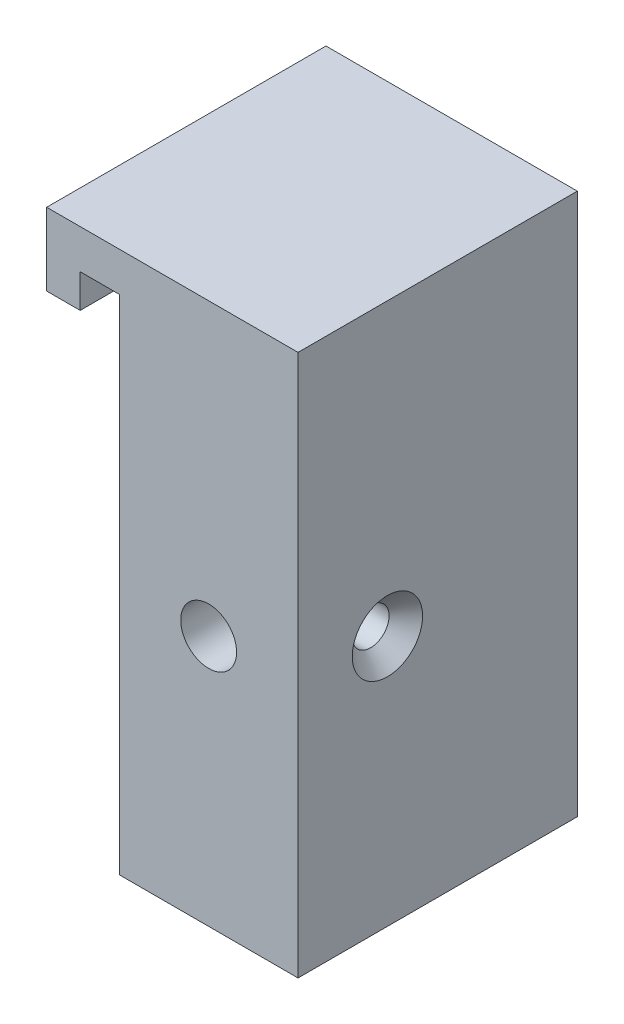
ISO-10303-21;
HEADER;
FILE_DESCRIPTION(('STEP AP214'),'2;1');
FILE_NAME('part.step','',(''),(''),'','','');
FILE_SCHEMA(('AUTOMOTIVE_DESIGN { 1 0 10303 214 1 1 1 1 }'));
ENDSEC;
DATA;
#1=APPLICATION_CONTEXT('core data for automotive mechanical design processes');
#2=APPLICATION_PROTOCOL_DEFINITION('international standard','automotive_design',2000,#1);
#3=PRODUCT_CONTEXT('',#1,'mechanical');
#4=PRODUCT('Part','Part','',(#3));
#5=PRODUCT_RELATED_PRODUCT_CATEGORY('part','',(#4));
#6=PRODUCT_DEFINITION_FORMATION('','',#4);
#7=PRODUCT_DEFINITION_CONTEXT('part definition',#1,'design');
#8=PRODUCT_DEFINITION('design','',#6,#7);
#9=PRODUCT_DEFINITION_SHAPE('','',#8);
#10=(LENGTH_UNIT() NAMED_UNIT(*) SI_UNIT(.MILLI.,.METRE.));
#11=(NAMED_UNIT(*) PLANE_ANGLE_UNIT() SI_UNIT($,.RADIAN.));
#12=(NAMED_UNIT(*) SI_UNIT($,.STERADIAN.) SOLID_ANGLE_UNIT());
#13=UNCERTAINTY_MEASURE_WITH_UNIT(LENGTH_MEASURE(1.E-05),#10,'distance_accuracy_value','');
#14=(GEOMETRIC_REPRESENTATION_CONTEXT(3) GLOBAL_UNCERTAINTY_ASSIGNED_CONTEXT((#13)) GLOBAL_UNIT_ASSIGNED_CONTEXT((#10,
#11,#12)) REPRESENTATION_CONTEXT('',''));
#15=CARTESIAN_POINT('',(0.,0.,0.));
#16=DIRECTION('',(0.,0.,1.));
#17=DIRECTION('',(1.,0.,0.));
#18=AXIS2_PLACEMENT_3D('',#15,#16,#17);
#19=CARTESIAN_POINT('',(-32.,0.,25.));
#20=DIRECTION('',(0.,1.,0.));
#21=DIRECTION('',(0.,0.,1.));
#22=AXIS2_PLACEMENT_3D('',#19,#20,#21);
#23=PLANE('',#22);
#24=CARTESIAN_POINT('',(-7.,0.,0.));
#25=DIRECTION('',(0.,-1.,0.));
#26=DIRECTION('',(0.,0.,-1.));
#27=AXIS2_PLACEMENT_3D('',#24,#25,#26);
#28=CIRCLE('',#27,3.5);
#29=CARTESIAN_POINT('',(-7.,0.,-3.5));
#30=VERTEX_POINT('',#29);
#31=EDGE_CURVE('E231',#30,#30,#28,.T.);
#32=ORIENTED_EDGE('',*,*,#31,.F.);
#33=EDGE_LOOP('',(#32));
#34=FACE_BOUND('',#33,.T.);
#35=CARTESIAN_POINT('',(-25.,0.,0.));
#36=DIRECTION('',(0.,-1.,0.));
#37=DIRECTION('',(0.,0.,-1.));
#38=AXIS2_PLACEMENT_3D('',#35,#36,#37);
#39=CIRCLE('',#38,3.5);
#40=CARTESIAN_POINT('',(-25.,0.,-3.5));
#41=VERTEX_POINT('',#40);
#42=EDGE_CURVE('E223',#41,#41,#39,.T.);
#43=ORIENTED_EDGE('',*,*,#42,.F.);
#44=EDGE_LOOP('',(#43));
#45=FACE_BOUND('',#44,.T.);
#46=DIRECTION('',(1.,0.,0.));
#47=VECTOR('',#46,1.);
#48=CARTESIAN_POINT('',(-32.,0.,-25.));
#49=LINE('',#48,#47);
#50=CARTESIAN_POINT('',(-32.,0.,-25.));
#51=VERTEX_POINT('',#50);
#52=CARTESIAN_POINT('',(0.,0.,-25.));
#53=VERTEX_POINT('',#52);
#54=EDGE_CURVE('E145',#51,#53,#49,.T.);
#55=ORIENTED_EDGE('',*,*,#54,.T.);
#56=DIRECTION('',(0.,0.,-1.));
#57=VECTOR('',#56,1.);
#58=CARTESIAN_POINT('',(0.,0.,25.));
#59=LINE('',#58,#57);
#60=CARTESIAN_POINT('',(0.,0.,25.));
#61=VERTEX_POINT('',#60);
#62=EDGE_CURVE('E11',#61,#53,#59,.T.);
#63=ORIENTED_EDGE('',*,*,#62,.F.);
#64=DIRECTION('',(1.,0.,0.));
#65=VECTOR('',#64,1.);
#66=CARTESIAN_POINT('',(-32.,0.,25.));
#67=LINE('',#66,#65);
#68=CARTESIAN_POINT('',(-32.,0.,25.));
#69=VERTEX_POINT('',#68);
#70=EDGE_CURVE('E168',#69,#61,#67,.T.);
#71=ORIENTED_EDGE('',*,*,#70,.F.);
#72=DIRECTION('',(0.,0.,-1.));
#73=VECTOR('',#72,1.);
#74=CARTESIAN_POINT('',(-32.,0.,25.));
#75=LINE('',#74,#73);
#76=EDGE_CURVE('E141',#69,#51,#75,.T.);
#77=ORIENTED_EDGE('',*,*,#76,.T.);
#78=EDGE_LOOP('',(#55,#63,#71,#77));
#79=FACE_BOUND('',#78,.T.);
#80=ADVANCED_FACE('F44',(#34,#45,#79),#23,.F.);
#81=CARTESIAN_POINT('',(0.,0.,25.));
#82=DIRECTION('',(-1.,0.,0.));
#83=DIRECTION('',(0.,0.,1.));
#84=AXIS2_PLACEMENT_3D('',#81,#82,#83);
#85=PLANE('',#84);
#86=CARTESIAN_POINT('',(0.,45.,9.));
#87=DIRECTION('',(1.,0.,0.));
#88=DIRECTION('',(0.,0.,-1.));
#89=AXIS2_PLACEMENT_3D('',#86,#87,#88);
#90=CIRCLE('',#89,6.3);
#91=CARTESIAN_POINT('',(0.,45.,2.7));
#92=VERTEX_POINT('',#91);
#93=EDGE_CURVE('E438',#92,#92,#90,.T.);
#94=ORIENTED_EDGE('',*,*,#93,.F.);
#95=EDGE_LOOP('',(#94));
#96=FACE_BOUND('',#95,.T.);
#97=DIRECTION('',(0.,1.,0.));
#98=VECTOR('',#97,1.);
#99=CARTESIAN_POINT('',(0.,0.,-25.));
#100=LINE('',#99,#98);
#101=CARTESIAN_POINT('',(0.,97.,-25.));
#102=VERTEX_POINT('',#101);
#103=EDGE_CURVE('E149',#53,#102,#100,.T.);
#104=ORIENTED_EDGE('',*,*,#103,.T.);
#105=DIRECTION('',(0.,0.,-1.));
#106=VECTOR('',#105,1.);
#107=CARTESIAN_POINT('',(0.,97.,25.));
#108=LINE('',#107,#106);
#109=CARTESIAN_POINT('',(0.,97.,25.));
#110=VERTEX_POINT('',#109);
#111=EDGE_CURVE('E53',#110,#102,#108,.T.);
#112=ORIENTED_EDGE('',*,*,#111,.F.);
#113=DIRECTION('',(0.,1.,0.));
#114=VECTOR('',#113,1.);
#115=CARTESIAN_POINT('',(0.,0.,25.));
#116=LINE('',#115,#114);
#117=EDGE_CURVE('E104',#61,#110,#116,.T.);
#118=ORIENTED_EDGE('',*,*,#117,.F.);
#119=ORIENTED_EDGE('',*,*,#62,.T.);
#120=EDGE_LOOP('',(#104,#112,#118,#119));
#121=FACE_BOUND('',#120,.T.);
#122=ADVANCED_FACE('F262',(#96,#121),#85,.F.);
#123=CARTESIAN_POINT('',(0.,97.,25.));
#124=DIRECTION('',(0.,-1.,0.));
#125=DIRECTION('',(0.,0.,-1.));
#126=AXIS2_PLACEMENT_3D('',#123,#124,#125);
#127=PLANE('',#126);
#128=DIRECTION('',(-1.,0.,0.));
#129=VECTOR('',#128,1.);
#130=CARTESIAN_POINT('',(0.,97.,-25.));
#131=LINE('',#130,#129);
#132=CARTESIAN_POINT('',(-45.,97.,-25.));
#133=VERTEX_POINT('',#132);
#134=EDGE_CURVE('E153',#102,#133,#131,.T.);
#135=ORIENTED_EDGE('',*,*,#134,.T.);
#136=DIRECTION('',(0.,0.,-1.));
#137=VECTOR('',#136,1.);
#138=CARTESIAN_POINT('',(-45.,97.,25.));
#139=LINE('',#138,#137);
#140=CARTESIAN_POINT('',(-45.,97.,25.));
#141=VERTEX_POINT('',#140);
#142=EDGE_CURVE('E179',#141,#133,#139,.T.);
#143=ORIENTED_EDGE('',*,*,#142,.F.);
#144=DIRECTION('',(-1.,0.,0.));
#145=VECTOR('',#144,1.);
#146=CARTESIAN_POINT('',(0.,97.,25.));
#147=LINE('',#146,#145);
#148=EDGE_CURVE('E189',#110,#141,#147,.T.);
#149=ORIENTED_EDGE('',*,*,#148,.F.);
#150=ORIENTED_EDGE('',*,*,#111,.T.);
#151=EDGE_LOOP('',(#135,#143,#149,#150));
#152=FACE_BOUND('',#151,.T.);
#153=ADVANCED_FACE('F187',(#152),#127,.F.);
#154=CARTESIAN_POINT('',(-45.,97.,25.));
#155=DIRECTION('',(1.,0.,0.));
#156=DIRECTION('',(0.,0.,-1.));
#157=AXIS2_PLACEMENT_3D('',#154,#155,#156);
#158=PLANE('',#157);
#159=DIRECTION('',(0.,-1.,0.));
#160=VECTOR('',#159,1.);
#161=CARTESIAN_POINT('',(-45.,97.,-25.));
#162=LINE('',#161,#160);
#163=CARTESIAN_POINT('',(-45.,84.,-25.));
#164=VERTEX_POINT('',#163);
#165=EDGE_CURVE('E156',#133,#164,#162,.T.);
#166=ORIENTED_EDGE('',*,*,#165,.T.);
#167=DIRECTION('',(0.,0.,-1.));
#168=VECTOR('',#167,1.);
#169=CARTESIAN_POINT('',(-45.,84.,25.));
#170=LINE('',#169,#168);
#171=CARTESIAN_POINT('',(-45.,84.,25.));
#172=VERTEX_POINT('',#171);
#173=EDGE_CURVE('E175',#172,#164,#170,.T.);
#174=ORIENTED_EDGE('',*,*,#173,.F.);
#175=DIRECTION('',(0.,-1.,0.));
#176=VECTOR('',#175,1.);
#177=CARTESIAN_POINT('',(-45.,97.,25.));
#178=LINE('',#177,#176);
#179=EDGE_CURVE('E202',#141,#172,#178,.T.);
#180=ORIENTED_EDGE('',*,*,#179,.F.);
#181=ORIENTED_EDGE('',*,*,#142,.T.);
#182=EDGE_LOOP('',(#166,#174,#180,#181));
#183=FACE_BOUND('',#182,.T.);
#184=ADVANCED_FACE('F197',(#183),#158,.F.);
#185=CARTESIAN_POINT('',(-45.,84.,25.));
#186=DIRECTION('',(0.,1.,0.));
#187=DIRECTION('',(0.,0.,1.));
#188=AXIS2_PLACEMENT_3D('',#185,#186,#187);
#189=PLANE('',#188);
#190=DIRECTION('',(1.,0.,0.));
#191=VECTOR('',#190,1.);
#192=CARTESIAN_POINT('',(-45.,84.,-25.));
#193=LINE('',#192,#191);
#194=CARTESIAN_POINT('',(-39.,84.,-25.));
#195=VERTEX_POINT('',#194);
#196=EDGE_CURVE('E159',#164,#195,#193,.T.);
#197=ORIENTED_EDGE('',*,*,#196,.T.);
#198=DIRECTION('',(0.,0.,-1.));
#199=VECTOR('',#198,1.);
#200=CARTESIAN_POINT('',(-39.,84.,25.));
#201=LINE('',#200,#199);
#202=CARTESIAN_POINT('',(-39.,84.,25.));
#203=VERTEX_POINT('',#202);
#204=EDGE_CURVE('E134',#203,#195,#201,.T.);
#205=ORIENTED_EDGE('',*,*,#204,.F.);
#206=DIRECTION('',(1.,0.,0.));
#207=VECTOR('',#206,1.);
#208=CARTESIAN_POINT('',(-45.,84.,25.));
#209=LINE('',#208,#207);
#210=EDGE_CURVE('E123',#172,#203,#209,.T.);
#211=ORIENTED_EDGE('',*,*,#210,.F.);
#212=ORIENTED_EDGE('',*,*,#173,.T.);
#213=EDGE_LOOP('',(#197,#205,#211,#212));
#214=FACE_BOUND('',#213,.T.);
#215=ADVANCED_FACE('F200',(#214),#189,.F.);
#216=CARTESIAN_POINT('',(-39.,84.,25.));
#217=DIRECTION('',(-1.,0.,0.));
#218=DIRECTION('',(0.,0.,1.));
#219=AXIS2_PLACEMENT_3D('',#216,#217,#218);
#220=PLANE('',#219);
#221=DIRECTION('',(0.,1.,0.));
#222=VECTOR('',#221,1.);
#223=CARTESIAN_POINT('',(-39.,84.,-25.));
#224=LINE('',#223,#222);
#225=CARTESIAN_POINT('',(-39.,90.,-25.));
#226=VERTEX_POINT('',#225);
#227=EDGE_CURVE('E132',#195,#226,#224,.T.);
#228=ORIENTED_EDGE('',*,*,#227,.T.);
#229=DIRECTION('',(0.,0.,-1.));
#230=VECTOR('',#229,1.);
#231=CARTESIAN_POINT('',(-39.,90.,25.));
#232=LINE('',#231,#230);
#233=CARTESIAN_POINT('',(-39.,90.,25.));
#234=VERTEX_POINT('',#233);
#235=EDGE_CURVE('E129',#234,#226,#232,.T.);
#236=ORIENTED_EDGE('',*,*,#235,.F.);
#237=DIRECTION('',(0.,1.,0.));
#238=VECTOR('',#237,1.);
#239=CARTESIAN_POINT('',(-39.,84.,25.));
#240=LINE('',#239,#238);
#241=EDGE_CURVE('E117',#203,#234,#240,.T.);
#242=ORIENTED_EDGE('',*,*,#241,.F.);
#243=ORIENTED_EDGE('',*,*,#204,.T.);
#244=EDGE_LOOP('',(#228,#236,#242,#243));
#245=FACE_BOUND('',#244,.T.);
#246=ADVANCED_FACE('F130',(#245),#220,.F.);
#247=CARTESIAN_POINT('',(-39.,90.,25.));
#248=DIRECTION('',(0.,1.,0.));
#249=DIRECTION('',(0.,0.,1.));
#250=AXIS2_PLACEMENT_3D('',#247,#248,#249);
#251=PLANE('',#250);
#252=DIRECTION('',(1.,0.,0.));
#253=VECTOR('',#252,1.);
#254=CARTESIAN_POINT('',(-39.,90.,-25.));
#255=LINE('',#254,#253);
#256=CARTESIAN_POINT('',(-32.,90.,-25.));
#257=VERTEX_POINT('',#256);
#258=EDGE_CURVE('E90',#226,#257,#255,.T.);
#259=ORIENTED_EDGE('',*,*,#258,.T.);
#260=DIRECTION('',(0.,0.,-1.));
#261=VECTOR('',#260,1.);
#262=CARTESIAN_POINT('',(-32.,90.,25.));
#263=LINE('',#262,#261);
#264=CARTESIAN_POINT('',(-32.,90.,25.));
#265=VERTEX_POINT('',#264);
#266=EDGE_CURVE('E135',#265,#257,#263,.T.);
#267=ORIENTED_EDGE('',*,*,#266,.F.);
#268=DIRECTION('',(1.,0.,0.));
#269=VECTOR('',#268,1.);
#270=CARTESIAN_POINT('',(-39.,90.,25.));
#271=LINE('',#270,#269);
#272=EDGE_CURVE('E121',#234,#265,#271,.T.);
#273=ORIENTED_EDGE('',*,*,#272,.F.);
#274=ORIENTED_EDGE('',*,*,#235,.T.);
#275=EDGE_LOOP('',(#259,#267,#273,#274));
#276=FACE_BOUND('',#275,.T.);
#277=ADVANCED_FACE('F137',(#276),#251,.F.);
#278=CARTESIAN_POINT('',(-32.,90.,25.));
#279=DIRECTION('',(1.,0.,0.));
#280=DIRECTION('',(0.,1.,0.));
#281=AXIS2_PLACEMENT_3D('',#278,#279,#280);
#282=PLANE('',#281);
#283=DIRECTION('',(0.,-1.,0.));
#284=VECTOR('',#283,1.);
#285=CARTESIAN_POINT('',(-32.,90.,-25.));
#286=LINE('',#285,#284);
#287=EDGE_CURVE('E96',#257,#51,#286,.T.);
#288=ORIENTED_EDGE('',*,*,#287,.T.);
#289=ORIENTED_EDGE('',*,*,#76,.F.);
#290=DIRECTION('',(0.,-1.,0.));
#291=VECTOR('',#290,1.);
#292=CARTESIAN_POINT('',(-32.,90.,25.));
#293=LINE('',#292,#291);
#294=EDGE_CURVE('E61',#265,#69,#293,.T.);
#295=ORIENTED_EDGE('',*,*,#294,.F.);
#296=ORIENTED_EDGE('',*,*,#266,.T.);
#297=EDGE_LOOP('',(#288,#289,#295,#296));
#298=FACE_BOUND('',#297,.T.);
#299=ADVANCED_FACE('F274',(#298),#282,.F.);
#300=CARTESIAN_POINT('',(0.,0.,25.));
#301=DIRECTION('',(0.,0.,1.));
#302=DIRECTION('',(1.,0.,0.));
#303=AXIS2_PLACEMENT_3D('',#300,#301,#302);
#304=PLANE('',#303);
#305=CARTESIAN_POINT('',(-16.,45.,25.));
#306=DIRECTION('',(0.,0.,1.));
#307=DIRECTION('',(1.,0.,0.));
#308=AXIS2_PLACEMENT_3D('',#305,#306,#307);
#309=CIRCLE('',#308,4.99999999999999);
#310=CARTESIAN_POINT('',(-11.,45.,25.));
#311=VERTEX_POINT('',#310);
#312=EDGE_CURVE('E215',#311,#311,#309,.T.);
#313=ORIENTED_EDGE('',*,*,#312,.F.);
#314=EDGE_LOOP('',(#313));
#315=FACE_BOUND('',#314,.T.);
#316=ORIENTED_EDGE('',*,*,#70,.T.);
#317=ORIENTED_EDGE('',*,*,#117,.T.);
#318=ORIENTED_EDGE('',*,*,#148,.T.);
#319=ORIENTED_EDGE('',*,*,#179,.T.);
#320=ORIENTED_EDGE('',*,*,#210,.T.);
#321=ORIENTED_EDGE('',*,*,#241,.T.);
#322=ORIENTED_EDGE('',*,*,#272,.T.);
#323=ORIENTED_EDGE('',*,*,#294,.T.);
#324=EDGE_LOOP('',(#316,#317,#318,#319,#320,#321,#322,#323));
#325=FACE_BOUND('',#324,.T.);
#326=ADVANCED_FACE('F119',(#315,#325),#304,.T.);
#327=CARTESIAN_POINT('',(0.,0.,-25.));
#328=DIRECTION('',(0.,0.,1.));
#329=DIRECTION('',(1.,0.,0.));
#330=AXIS2_PLACEMENT_3D('',#327,#328,#329);
#331=PLANE('',#330);
#332=ORIENTED_EDGE('',*,*,#54,.F.);
#333=ORIENTED_EDGE('',*,*,#287,.F.);
#334=ORIENTED_EDGE('',*,*,#258,.F.);
#335=ORIENTED_EDGE('',*,*,#227,.F.);
#336=ORIENTED_EDGE('',*,*,#196,.F.);
#337=ORIENTED_EDGE('',*,*,#165,.F.);
#338=ORIENTED_EDGE('',*,*,#134,.F.);
#339=ORIENTED_EDGE('',*,*,#103,.F.);
#340=EDGE_LOOP('',(#332,#333,#334,#335,#336,#337,#338,#339));
#341=FACE_BOUND('',#340,.T.);
#342=ADVANCED_FACE('F193',(#341),#331,.F.);
#343=CARTESIAN_POINT('',(-16.,45.,0.));
#344=DIRECTION('',(0.,0.,-1.));
#345=DIRECTION('',(-1.,0.,0.));
#346=AXIS2_PLACEMENT_3D('',#343,#344,#345);
#347=PLANE('',#346);
#348=CARTESIAN_POINT('',(-16.,45.,0.));
#349=DIRECTION('',(0.,0.,1.));
#350=DIRECTION('',(1.,0.,0.));
#351=AXIS2_PLACEMENT_3D('',#348,#349,#350);
#352=CIRCLE('',#351,5.);
#353=CARTESIAN_POINT('',(-11.,45.,0.));
#354=VERTEX_POINT('',#353);
#355=EDGE_CURVE('E150',#354,#354,#352,.T.);
#356=ORIENTED_EDGE('',*,*,#355,.T.);
#357=EDGE_LOOP('',(#356));
#358=FACE_BOUND('',#357,.T.);
#359=ADVANCED_FACE('F327',(#358),#347,.F.);
#360=CARTESIAN_POINT('',(-16.,45.,25.));
#361=DIRECTION('',(0.,0.,1.));
#362=DIRECTION('',(1.,0.,0.));
#363=AXIS2_PLACEMENT_3D('',#360,#361,#362);
#364=CYLINDRICAL_SURFACE('',#363,4.99999999999999);
#365=CARTESIAN_POINT('',(-11.,45.,5.7));
#366=CARTESIAN_POINT('',(-11.0000049797154,45.1661087100987,5.70000563881154));
#367=CARTESIAN_POINT('',(-11.0083524634531,45.3322524989141,5.7126141749076));
#368=CARTESIAN_POINT('',(-11.0409234694194,45.6592567617237,5.76228740100713));
#369=CARTESIAN_POINT('',(-11.0651567672503,45.8201139184527,5.79936714987673));
#370=CARTESIAN_POINT('',(-11.1270986084443,46.1313331561117,5.89572565911595));
#371=CARTESIAN_POINT('',(-11.1647438439377,46.2817406424397,5.95490018829852));
#372=CARTESIAN_POINT('',(-11.2504695616458,46.5699020330071,6.09294607884066));
#373=CARTESIAN_POINT('',(-11.2985514060137,46.7076542821815,6.17182001150683));
#374=CARTESIAN_POINT('',(-11.4060867911775,46.979673696901,6.35426097362401));
#375=CARTESIAN_POINT('',(-11.4661566282803,47.1126733871233,6.45934686831311));
#376=CARTESIAN_POINT('',(-11.5900230834179,47.3603657120324,6.68762095320567));
#377=CARTESIAN_POINT('',(-11.6538248966216,47.4750319550074,6.81083475826332));
#378=CARTESIAN_POINT('',(-11.7898643082952,47.7008629807824,7.0939492140042));
#379=CARTESIAN_POINT('',(-11.8618864748207,47.8087642040079,7.25657733864784));
#380=CARTESIAN_POINT('',(-11.995014962994,47.9955398648891,7.60175833309369));
#381=CARTESIAN_POINT('',(-12.0561400699281,48.0744645087173,7.78427602269469));
#382=CARTESIAN_POINT('',(-12.1423199014631,48.1814498113181,8.11172878951611));
#383=CARTESIAN_POINT('',(-12.1726885920174,48.2175904716384,8.25261206169051));
#384=CARTESIAN_POINT('',(-12.2182831314955,48.2710679853448,8.54019629776967));
#385=CARTESIAN_POINT('',(-12.2335342900591,48.2884362716981,8.68688710898576));
#386=CARTESIAN_POINT('',(-12.2465449744928,48.3032852247162,8.98264665166635));
#387=CARTESIAN_POINT('',(-12.2442377287774,48.3006899730821,9.13172230697425));
#388=CARTESIAN_POINT('',(-12.2223621152483,48.2756222186249,9.42695292340378));
#389=CARTESIAN_POINT('',(-12.2027791676102,48.2531329261869,9.57310531086286));
#390=CARTESIAN_POINT('',(-12.1504570753132,48.1910124970141,9.85273517754464));
#391=CARTESIAN_POINT('',(-12.1182797607473,48.1521084836889,9.98648608064626));
#392=CARTESIAN_POINT('',(-12.0444598389076,48.0589582049994,10.2456990825193));
#393=CARTESIAN_POINT('',(-12.0028141254295,48.0047069033715,10.3711584436942));
#394=CARTESIAN_POINT('',(-11.9046531058894,47.8699111884053,10.6370981864322));
#395=CARTESIAN_POINT('',(-11.8468317802024,47.7862730940456,10.775524579753));
#396=CARTESIAN_POINT('',(-11.7280363725581,47.6004841327672,11.0379838641635));
#397=CARTESIAN_POINT('',(-11.6670584944019,47.4983105864853,11.1619988134985));
#398=CARTESIAN_POINT('',(-11.5340948567937,47.2536335024306,11.4184083647856));
#399=CARTESIAN_POINT('',(-11.4624416177138,47.1071594582894,11.5472287368739));
#400=CARTESIAN_POINT('',(-11.3286179097636,46.7909702877268,11.7786124817198));
#401=CARTESIAN_POINT('',(-11.2664382167047,46.6212780779611,11.8812014623099));
#402=CARTESIAN_POINT('',(-11.168928367278,46.2974788525532,12.0384612597186));
#403=CARTESIAN_POINT('',(-11.1307217244945,46.1468928151785,12.0985914076143));
#404=CARTESIAN_POINT('',(-11.0678331707962,45.8359521027454,12.1965119370802));
#405=CARTESIAN_POINT('',(-11.0431399435349,45.6756057265899,12.234321012764));
#406=CARTESIAN_POINT('',(-11.0094619344049,45.3487335191435,12.2857042508974));
#407=CARTESIAN_POINT('',(-11.0005409947037,45.18218534702,12.2991799226505));
#408=CARTESIAN_POINT('',(-10.9995073484331,44.8489090457051,12.3007468299301));
#409=CARTESIAN_POINT('',(-11.0073940861588,44.6821809226455,12.2888389047035));
#410=CARTESIAN_POINT('',(-11.0381144739819,44.3648180098666,12.2420035404811));
#411=CARTESIAN_POINT('',(-11.0599303704839,44.2138461881654,12.2086424963732));
#412=CARTESIAN_POINT('',(-11.115716364273,43.9201198017955,12.1220697131047));
#413=CARTESIAN_POINT('',(-11.149688413659,43.7773665611864,12.0688547856446));
#414=CARTESIAN_POINT('',(-11.2298142207509,43.4938761988668,11.940636026081));
#415=CARTESIAN_POINT('',(-11.2766112254084,43.3538600219115,11.8644503801412));
#416=CARTESIAN_POINT('',(-11.3777922471039,43.0880751119317,11.6943421553612));
#417=CARTESIAN_POINT('',(-11.4321812636818,42.9623158671781,11.6004078740449));
#418=CARTESIAN_POINT('',(-11.5538280129421,42.7077432255084,11.3807783916206));
#419=CARTESIAN_POINT('',(-11.6217646528427,42.5815574778501,11.2524116616523));
#420=CARTESIAN_POINT('',(-11.7570334586798,42.3514041365164,10.9766688555345));
#421=CARTESIAN_POINT('',(-11.8243652525539,42.2474494264298,10.8292818354255));
#422=CARTESIAN_POINT('',(-11.9450818895731,42.0729271989075,10.5325932013654));
#423=CARTESIAN_POINT('',(-11.9991878465187,42.0000669770535,10.3849409045406));
#424=CARTESIAN_POINT('',(-12.0950428186977,41.8763057404337,10.0770073618075));
#425=CARTESIAN_POINT('',(-12.1368141046753,41.8253650720246,9.9167495467197));
#426=CARTESIAN_POINT('',(-12.196134537061,41.7546360091226,9.61440287747852));
#427=CARTESIAN_POINT('',(-12.2165736459902,41.7310523388888,9.47378333949387));
#428=CARTESIAN_POINT('',(-12.2415625924058,41.702343443817,9.18932233689651));
#429=CARTESIAN_POINT('',(-12.2461276659184,41.6972005192559,9.04548409518438));
#430=CARTESIAN_POINT('',(-12.2386678946208,41.7057014647664,8.75881774896694));
#431=CARTESIAN_POINT('',(-12.2266424723678,41.7193459887472,8.61598967979526));
#432=CARTESIAN_POINT('',(-12.1878441499623,41.7645212077345,8.33519507026765));
#433=CARTESIAN_POINT('',(-12.1610517879487,41.7960755082945,8.19723520174039));
#434=CARTESIAN_POINT('',(-12.0871097750882,41.8865523633796,7.89165869428481));
#435=CARTESIAN_POINT('',(-12.036371775352,41.9506440086559,7.72645649367746));
#436=CARTESIAN_POINT('',(-11.9241661332735,42.1023357957535,7.41121035872069));
#437=CARTESIAN_POINT('',(-11.8626836254042,42.1899685992997,7.26118788634872));
#438=CARTESIAN_POINT('',(-11.7347037090171,42.3882138879942,6.97531592053781));
#439=CARTESIAN_POINT('',(-11.668138277504,42.4991953933869,6.83975428969386));
#440=CARTESIAN_POINT('',(-11.5368598966754,42.7418191193346,6.5872754380614));
#441=CARTESIAN_POINT('',(-11.4721474845825,42.8734672612163,6.4703635801509));
#442=CARTESIAN_POINT('',(-11.3766753568583,43.0941123541336,6.30416781907634));
#443=CARTESIAN_POINT('',(-11.3434197121207,43.176660583831,6.24763157721441));
#444=CARTESIAN_POINT('',(-11.2801161233333,43.3474338100589,6.14183545128243));
#445=CARTESIAN_POINT('',(-11.2500666482714,43.4356560645748,6.09257208991119));
#446=CARTESIAN_POINT('',(-11.1940790450875,43.6172015068521,6.00197690845561));
#447=CARTESIAN_POINT('',(-11.1681360445847,43.7105184700789,5.9606356762103));
#448=CARTESIAN_POINT('',(-11.1211445044182,43.9016105670623,5.88647294994931));
#449=CARTESIAN_POINT('',(-11.1000939727632,43.9993838669377,5.85364798785964));
#450=CARTESIAN_POINT('',(-11.0553188091737,44.2438667406585,5.78427636240847));
#451=CARTESIAN_POINT('',(-11.0347150137608,44.3926503680684,5.75279949242883));
#452=CARTESIAN_POINT('',(-11.0070569563001,44.6942809111282,5.71066430711762));
#453=CARTESIAN_POINT('',(-10.9999954170314,44.8471255996827,5.69999481044714));
#454=CARTESIAN_POINT('',(-11.,45.,5.7));
#455=B_SPLINE_CURVE_WITH_KNOTS('',3,(#365,#366,#367,#368,#369,#370,#371,#372,#373,#374,#375,
#376,#377,#378,#379,#380,#381,#382,#383,#384,#385,#386,#387,#388,#389,#390,#391,#392,#393,#394,
#395,#396,#397,#398,#399,#400,#401,#402,#403,#404,#405,#406,#407,#408,#409,#410,#411,#412,#413,
#414,#415,#416,#417,#418,#419,#420,#421,#422,#423,#424,#425,#426,#427,#428,#429,#430,#431,#432,
#433,#434,#435,#436,#437,#438,#439,#440,#441,#442,#443,#444,#445,#446,#447,#448,#449,#450,#451,
#452,#453,#454),.UNSPECIFIED.,.T.,.F.,(4,2,2,2,2,2,2,2,2,2,2,2,2,2,2,2,2,2,2,2,2,2,2,2,2,2,2,2,
2,2,2,2,2,2,2,2,2,2,2,2,2,2,2,2,4),(0.,0.497726346438328,0.995759265011474,1.49147182327556,
1.98724911932336,2.52472285398069,3.06296346909751,3.68416119442295,4.30427746662549,
4.74824206332347,5.19146211660388,5.63636849926013,6.0816507201402,6.50899317832884,
6.93647603335878,7.44993759598858,7.96403170330015,8.58448225944135,9.20432478137938,
9.70198972827775,10.1992372825104,10.6984929984064,11.1977322078819,11.6641183533543,
12.1305794272009,12.627059041866,13.1238671575371,13.6987737764681,14.2740126744385,
14.7920218070748,15.3090898529516,15.7393109775655,16.1691190583515,16.5989420992603,
17.0293329781066,17.5793444324805,18.130122966495,18.6903664780719,19.2507708024659,
19.5666924494275,19.8824625556849,20.1978551421486,20.5131190892221,20.9714366484685,
21.4295078518911),.UNSPECIFIED.);
#456=CARTESIAN_POINT('',(-11.,45.,5.7));
#457=VERTEX_POINT('',#456);
#458=EDGE_CURVE('E235',#457,#457,#455,.T.);
#459=ORIENTED_EDGE('',*,*,#458,.T.);
#460=EDGE_LOOP('',(#459));
#461=FACE_BOUND('',#460,.T.);
#462=ORIENTED_EDGE('',*,*,#355,.F.);
#463=EDGE_LOOP('',(#462));
#464=FACE_BOUND('',#463,.T.);
#465=ORIENTED_EDGE('',*,*,#312,.T.);
#466=EDGE_LOOP('',(#465));
#467=FACE_BOUND('',#466,.T.);
#468=ADVANCED_FACE('F340',(#461,#464,#467),#364,.F.);
#469=CARTESIAN_POINT('',(-25.,15.,0.));
#470=DIRECTION('',(0.,1.,0.));
#471=DIRECTION('',(0.,0.,1.));
#472=AXIS2_PLACEMENT_3D('',#469,#470,#471);
#473=PLANE('',#472);
#474=CARTESIAN_POINT('',(-25.,15.,0.));
#475=DIRECTION('',(0.,-1.,0.));
#476=DIRECTION('',(0.,0.,-1.));
#477=AXIS2_PLACEMENT_3D('',#474,#475,#476);
#478=CIRCLE('',#477,3.5);
#479=CARTESIAN_POINT('',(-25.,15.,-3.5));
#480=VERTEX_POINT('',#479);
#481=EDGE_CURVE('E219',#480,#480,#478,.T.);
#482=ORIENTED_EDGE('',*,*,#481,.T.);
#483=EDGE_LOOP('',(#482));
#484=FACE_BOUND('',#483,.T.);
#485=ADVANCED_FACE('F358',(#484),#473,.F.);
#486=CARTESIAN_POINT('',(-25.,0.,0.));
#487=DIRECTION('',(0.,-1.,0.));
#488=DIRECTION('',(0.,0.,-1.));
#489=AXIS2_PLACEMENT_3D('',#486,#487,#488);
#490=CYLINDRICAL_SURFACE('',#489,3.5);
#491=ORIENTED_EDGE('',*,*,#481,.F.);
#492=EDGE_LOOP('',(#491));
#493=FACE_BOUND('',#492,.T.);
#494=ORIENTED_EDGE('',*,*,#42,.T.);
#495=EDGE_LOOP('',(#494));
#496=FACE_BOUND('',#495,.T.);
#497=ADVANCED_FACE('F363',(#493,#496),#490,.F.);
#498=CARTESIAN_POINT('',(-7.,15.,0.));
#499=DIRECTION('',(0.,1.,0.));
#500=DIRECTION('',(0.,0.,1.));
#501=AXIS2_PLACEMENT_3D('',#498,#499,#500);
#502=PLANE('',#501);
#503=CARTESIAN_POINT('',(-7.,15.,0.));
#504=DIRECTION('',(0.,-1.,0.));
#505=DIRECTION('',(0.,0.,-1.));
#506=AXIS2_PLACEMENT_3D('',#503,#504,#505);
#507=CIRCLE('',#506,3.5);
#508=CARTESIAN_POINT('',(-7.,15.,-3.5));
#509=VERTEX_POINT('',#508);
#510=EDGE_CURVE('E227',#509,#509,#507,.T.);
#511=ORIENTED_EDGE('',*,*,#510,.T.);
#512=EDGE_LOOP('',(#511));
#513=FACE_BOUND('',#512,.T.);
#514=ADVANCED_FACE('F374',(#513),#502,.F.);
#515=CARTESIAN_POINT('',(-7.,0.,0.));
#516=DIRECTION('',(0.,-1.,0.));
#517=DIRECTION('',(0.,0.,-1.));
#518=AXIS2_PLACEMENT_3D('',#515,#516,#517);
#519=CYLINDRICAL_SURFACE('',#518,3.5);
#520=ORIENTED_EDGE('',*,*,#510,.F.);
#521=EDGE_LOOP('',(#520));
#522=FACE_BOUND('',#521,.T.);
#523=ORIENTED_EDGE('',*,*,#31,.T.);
#524=EDGE_LOOP('',(#523));
#525=FACE_BOUND('',#524,.T.);
#526=ADVANCED_FACE('F253',(#522,#525),#519,.F.);
#527=CARTESIAN_POINT('',(0.,45.,9.));
#528=DIRECTION('',(1.,0.,0.));
#529=DIRECTION('',(0.,0.,-1.));
#530=AXIS2_PLACEMENT_3D('',#527,#528,#529);
#531=CYLINDRICAL_SURFACE('',#530,3.3);
#532=ORIENTED_EDGE('',*,*,#458,.F.);
#533=EDGE_LOOP('',(#532));
#534=FACE_BOUND('',#533,.T.);
#535=CARTESIAN_POINT('',(-3.,45.,9.));
#536=DIRECTION('',(1.,0.,0.));
#537=DIRECTION('',(0.,0.,-1.));
#538=AXIS2_PLACEMENT_3D('',#535,#536,#537);
#539=CIRCLE('',#538,3.3);
#540=CARTESIAN_POINT('',(-3.,45.,5.7));
#541=VERTEX_POINT('',#540);
#542=EDGE_CURVE('E244',#541,#541,#539,.T.);
#543=ORIENTED_EDGE('',*,*,#542,.T.);
#544=EDGE_LOOP('',(#543));
#545=FACE_BOUND('',#544,.T.);
#546=ADVANCED_FACE('F248',(#534,#545),#531,.F.);
#547=CARTESIAN_POINT('',(0.,45.,9.));
#548=DIRECTION('',(1.,0.,0.));
#549=DIRECTION('',(0.,0.,-1.));
#550=AXIS2_PLACEMENT_3D('',#547,#548,#549);
#551=CONICAL_SURFACE('',#550,6.3,0.785398163397448);
#552=ORIENTED_EDGE('',*,*,#542,.F.);
#553=EDGE_LOOP('',(#552));
#554=FACE_BOUND('',#553,.T.);
#555=ORIENTED_EDGE('',*,*,#93,.T.);
#556=EDGE_LOOP('',(#555));
#557=FACE_BOUND('',#556,.T.);
#558=ADVANCED_FACE('F252',(#554,#557),#551,.F.);
#559=CLOSED_SHELL('',(#80,#122,#153,#184,#215,#246,#277,#299,#326,#342,#359,#468,#485,#497,#514,
#526,#546,#558));
#560=MANIFOLD_SOLID_BREP('B2',#559);
#561=ADVANCED_BREP_SHAPE_REPRESENTATION('',(#18,#560),#14);
#562=SHAPE_DEFINITION_REPRESENTATION(#9,#561);
ENDSEC;
END-ISO-10303-21;
